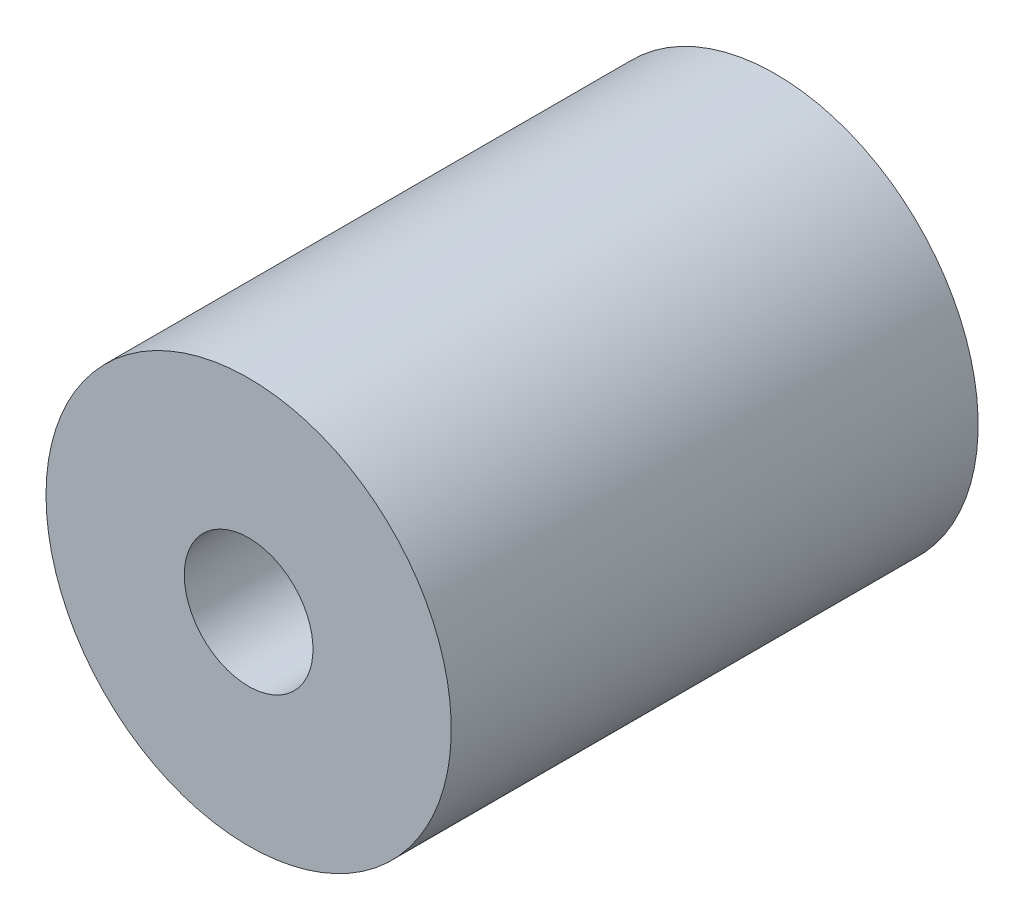
ISO-10303-21;
HEADER;
FILE_DESCRIPTION(('STEP AP214'),'2;1');
FILE_NAME('part.step','',(''),(''),'','','');
FILE_SCHEMA(('AUTOMOTIVE_DESIGN { 1 0 10303 214 1 1 1 1 }'));
ENDSEC;
DATA;
#1=APPLICATION_CONTEXT('core data for automotive mechanical design processes');
#2=APPLICATION_PROTOCOL_DEFINITION('international standard','automotive_design',2000,#1);
#3=PRODUCT_CONTEXT('',#1,'mechanical');
#4=PRODUCT('Part','Part','',(#3));
#5=PRODUCT_RELATED_PRODUCT_CATEGORY('part','',(#4));
#6=PRODUCT_DEFINITION_FORMATION('','',#4);
#7=PRODUCT_DEFINITION_CONTEXT('part definition',#1,'design');
#8=PRODUCT_DEFINITION('design','',#6,#7);
#9=PRODUCT_DEFINITION_SHAPE('','',#8);
#10=(LENGTH_UNIT() NAMED_UNIT(*) SI_UNIT(.MILLI.,.METRE.));
#11=(NAMED_UNIT(*) PLANE_ANGLE_UNIT() SI_UNIT($,.RADIAN.));
#12=(NAMED_UNIT(*) SI_UNIT($,.STERADIAN.) SOLID_ANGLE_UNIT());
#13=UNCERTAINTY_MEASURE_WITH_UNIT(LENGTH_MEASURE(1.E-05),#10,'distance_accuracy_value','');
#14=(GEOMETRIC_REPRESENTATION_CONTEXT(3) GLOBAL_UNCERTAINTY_ASSIGNED_CONTEXT((#13)) GLOBAL_UNIT_ASSIGNED_CONTEXT((#10,
#11,#12)) REPRESENTATION_CONTEXT('',''));
#15=CARTESIAN_POINT('',(0.,0.,0.));
#16=DIRECTION('',(0.,0.,1.));
#17=DIRECTION('',(1.,0.,0.));
#18=AXIS2_PLACEMENT_3D('',#15,#16,#17);
#19=CARTESIAN_POINT('',(0.,0.,26.));
#20=DIRECTION('',(0.,0.,-1.));
#21=DIRECTION('',(-1.,0.,0.));
#22=AXIS2_PLACEMENT_3D('',#19,#20,#21);
#23=CYLINDRICAL_SURFACE('',#22,3.175);
#24=CARTESIAN_POINT('',(0.,0.,26.));
#25=DIRECTION('',(0.,0.,1.));
#26=DIRECTION('',(1.,0.,0.));
#27=AXIS2_PLACEMENT_3D('',#24,#25,#26);
#28=CIRCLE('',#27,3.175);
#29=CARTESIAN_POINT('',(-3.175,0.,26.));
#30=VERTEX_POINT('',#29);
#31=EDGE_CURVE('E44',#30,#30,#28,.T.);
#32=CARTESIAN_POINT('',(0.,0.,6.5));
#33=DIRECTION('',(0.,0.,-1.));
#34=DIRECTION('',(-1.,0.,0.));
#35=AXIS2_PLACEMENT_3D('',#32,#33,#34);
#36=CIRCLE('',#35,3.175);
#37=CARTESIAN_POINT('',(-3.175,0.,6.5));
#38=VERTEX_POINT('',#37);
#39=EDGE_CURVE('E35',#38,#38,#36,.T.);
#40=CARTESIAN_POINT('',(-3.175,0.,26.));
#41=CARTESIAN_POINT('',(-3.175,0.,25.796875));
#42=CARTESIAN_POINT('',(-3.175,0.,25.59375));
#43=CARTESIAN_POINT('',(-3.175,0.,25.1875));
#44=CARTESIAN_POINT('',(-3.175,0.,24.984375));
#45=CARTESIAN_POINT('',(-3.175,0.,24.578125));
#46=CARTESIAN_POINT('',(-3.175,0.,24.375));
#47=CARTESIAN_POINT('',(-3.175,0.,23.96875));
#48=CARTESIAN_POINT('',(-3.175,0.,23.765625));
#49=CARTESIAN_POINT('',(-3.175,0.,23.359375));
#50=CARTESIAN_POINT('',(-3.175,0.,23.15625));
#51=CARTESIAN_POINT('',(-3.175,0.,22.75));
#52=CARTESIAN_POINT('',(-3.175,0.,22.546875));
#53=CARTESIAN_POINT('',(-3.175,0.,22.140625));
#54=CARTESIAN_POINT('',(-3.175,0.,21.9375));
#55=CARTESIAN_POINT('',(-3.175,0.,21.53125));
#56=CARTESIAN_POINT('',(-3.175,0.,21.328125));
#57=CARTESIAN_POINT('',(-3.175,0.,20.921875));
#58=CARTESIAN_POINT('',(-3.175,0.,20.71875));
#59=CARTESIAN_POINT('',(-3.175,0.,20.3125));
#60=CARTESIAN_POINT('',(-3.175,0.,20.109375));
#61=CARTESIAN_POINT('',(-3.175,0.,19.703125));
#62=CARTESIAN_POINT('',(-3.175,0.,19.5));
#63=CARTESIAN_POINT('',(-3.175,0.,19.09375));
#64=CARTESIAN_POINT('',(-3.175,0.,18.890625));
#65=CARTESIAN_POINT('',(-3.175,0.,18.484375));
#66=CARTESIAN_POINT('',(-3.175,0.,18.28125));
#67=CARTESIAN_POINT('',(-3.175,0.,17.875));
#68=CARTESIAN_POINT('',(-3.175,0.,17.671875));
#69=CARTESIAN_POINT('',(-3.175,0.,17.265625));
#70=CARTESIAN_POINT('',(-3.175,0.,17.0625));
#71=CARTESIAN_POINT('',(-3.175,0.,16.65625));
#72=CARTESIAN_POINT('',(-3.175,0.,16.453125));
#73=CARTESIAN_POINT('',(-3.175,0.,16.046875));
#74=CARTESIAN_POINT('',(-3.175,0.,15.84375));
#75=CARTESIAN_POINT('',(-3.175,0.,15.4375));
#76=CARTESIAN_POINT('',(-3.175,0.,15.234375));
#77=CARTESIAN_POINT('',(-3.175,0.,14.828125));
#78=CARTESIAN_POINT('',(-3.175,0.,14.625));
#79=CARTESIAN_POINT('',(-3.175,0.,14.21875));
#80=CARTESIAN_POINT('',(-3.175,0.,14.015625));
#81=CARTESIAN_POINT('',(-3.175,0.,13.609375));
#82=CARTESIAN_POINT('',(-3.175,0.,13.40625));
#83=CARTESIAN_POINT('',(-3.175,0.,13.));
#84=CARTESIAN_POINT('',(-3.175,0.,12.796875));
#85=CARTESIAN_POINT('',(-3.175,0.,12.390625));
#86=CARTESIAN_POINT('',(-3.175,0.,12.1875));
#87=CARTESIAN_POINT('',(-3.175,0.,11.78125));
#88=CARTESIAN_POINT('',(-3.175,0.,11.578125));
#89=CARTESIAN_POINT('',(-3.175,0.,11.171875));
#90=CARTESIAN_POINT('',(-3.175,0.,10.96875));
#91=CARTESIAN_POINT('',(-3.175,0.,10.5625));
#92=CARTESIAN_POINT('',(-3.175,0.,10.359375));
#93=CARTESIAN_POINT('',(-3.175,0.,9.953125));
#94=CARTESIAN_POINT('',(-3.175,0.,9.75));
#95=CARTESIAN_POINT('',(-3.175,0.,9.34375));
#96=CARTESIAN_POINT('',(-3.175,0.,9.140625));
#97=CARTESIAN_POINT('',(-3.175,0.,8.734375));
#98=CARTESIAN_POINT('',(-3.175,0.,8.53125));
#99=CARTESIAN_POINT('',(-3.175,0.,8.125));
#100=CARTESIAN_POINT('',(-3.175,0.,7.921875));
#101=CARTESIAN_POINT('',(-3.175,0.,7.515625));
#102=CARTESIAN_POINT('',(-3.175,0.,7.3125));
#103=CARTESIAN_POINT('',(-3.175,0.,6.90625));
#104=CARTESIAN_POINT('',(-3.175,0.,6.703125));
#105=CARTESIAN_POINT('',(-3.175,0.,6.5));
#106=B_SPLINE_CURVE_WITH_KNOTS('',3,(#40,#41,#42,#43,#44,#45,#46,#47,#48,#49,#50,#51,#52,#53,
#54,#55,#56,#57,#58,#59,#60,#61,#62,#63,#64,#65,#66,#67,#68,#69,#70,#71,#72,#73,#74,#75,#76,#77,
#78,#79,#80,#81,#82,#83,#84,#85,#86,#87,#88,#89,#90,#91,#92,#93,#94,#95,#96,#97,#98,#99,#100,
#101,#102,#103,#104,#105),.UNSPECIFIED.,.F.,.F.,(4,2,2,2,2,2,2,2,2,2,2,2,2,2,2,2,2,2,2,2,2,2,2,
2,2,2,2,2,2,2,2,2,4),(0.,0.609375000000002,1.21875,1.828125,2.4375,3.046875,3.65625,4.265625,
4.875,5.484375,6.09375,6.703125,7.3125,7.921875,8.53125,9.140625,9.75,10.359375,10.96875,
11.578125,12.1875,12.796875,13.40625,14.015625,14.625,15.234375,15.84375,16.453125,17.0625,
17.671875,18.28125,18.890625,19.5),.UNSPECIFIED.);
#107=EDGE_CURVE('BSEAM31',#30,#38,#106,.T.);
#108=ORIENTED_EDGE('',*,*,#31,.T.);
#109=ORIENTED_EDGE('',*,*,#39,.T.);
#110=ORIENTED_EDGE('',*,*,#107,.T.);
#111=ORIENTED_EDGE('',*,*,#107,.F.);
#112=EDGE_LOOP('',(#108,#110,#109,#111));
#113=FACE_BOUND('',#112,.T.);
#114=ADVANCED_FACE('F31',(#113),#23,.F.);
#115=CARTESIAN_POINT('',(0.,0.,26.));
#116=DIRECTION('',(0.,0.,1.));
#117=DIRECTION('',(1.,0.,0.));
#118=AXIS2_PLACEMENT_3D('',#115,#116,#117);
#119=PLANE('',#118);
#120=CARTESIAN_POINT('',(0.,0.,26.));
#121=DIRECTION('',(0.,0.,1.));
#122=DIRECTION('',(1.,0.,0.));
#123=AXIS2_PLACEMENT_3D('',#120,#121,#122);
#124=CIRCLE('',#123,10.);
#125=CARTESIAN_POINT('',(-10.,0.,26.));
#126=VERTEX_POINT('',#125);
#127=EDGE_CURVE('E10',#126,#126,#124,.T.);
#128=ORIENTED_EDGE('',*,*,#127,.T.);
#129=EDGE_LOOP('',(#128));
#130=FACE_BOUND('',#129,.T.);
#131=ORIENTED_EDGE('',*,*,#31,.F.);
#132=EDGE_LOOP('',(#131));
#133=FACE_BOUND('',#132,.T.);
#134=ADVANCED_FACE('F69',(#130,#133),#119,.T.);
#135=CARTESIAN_POINT('',(0.,0.,0.));
#136=DIRECTION('',(0.,0.,1.));
#137=DIRECTION('',(1.,0.,0.));
#138=AXIS2_PLACEMENT_3D('',#135,#136,#137);
#139=PLANE('',#138);
#140=CARTESIAN_POINT('',(0.,0.,0.));
#141=DIRECTION('',(0.,0.,-1.));
#142=DIRECTION('',(-1.,0.,0.));
#143=AXIS2_PLACEMENT_3D('',#140,#141,#142);
#144=CIRCLE('',#143,4.);
#145=CARTESIAN_POINT('',(-4.,0.,0.));
#146=VERTEX_POINT('',#145);
#147=EDGE_CURVE('E48',#146,#146,#144,.T.);
#148=ORIENTED_EDGE('',*,*,#147,.F.);
#149=EDGE_LOOP('',(#148));
#150=FACE_BOUND('',#149,.T.);
#151=CARTESIAN_POINT('',(0.,0.,0.));
#152=DIRECTION('',(0.,0.,1.));
#153=DIRECTION('',(1.,0.,0.));
#154=AXIS2_PLACEMENT_3D('',#151,#152,#153);
#155=CIRCLE('',#154,10.);
#156=CARTESIAN_POINT('',(-10.,0.,0.));
#157=VERTEX_POINT('',#156);
#158=EDGE_CURVE('E39',#157,#157,#155,.T.);
#159=ORIENTED_EDGE('',*,*,#158,.F.);
#160=EDGE_LOOP('',(#159));
#161=FACE_BOUND('',#160,.T.);
#162=ADVANCED_FACE('F75',(#150,#161),#139,.F.);
#163=CARTESIAN_POINT('',(0.,0.,26.));
#164=DIRECTION('',(0.,0.,-1.));
#165=DIRECTION('',(-1.,0.,0.));
#166=AXIS2_PLACEMENT_3D('',#163,#164,#165);
#167=CYLINDRICAL_SURFACE('',#166,10.);
#168=CARTESIAN_POINT('',(-10.,0.,26.));
#169=CARTESIAN_POINT('',(-10.,0.,25.7291666666667));
#170=CARTESIAN_POINT('',(-10.,0.,25.4583333333333));
#171=CARTESIAN_POINT('',(-10.,0.,24.9166666666667));
#172=CARTESIAN_POINT('',(-10.,0.,24.6458333333333));
#173=CARTESIAN_POINT('',(-10.,0.,24.1041666666667));
#174=CARTESIAN_POINT('',(-10.,0.,23.8333333333333));
#175=CARTESIAN_POINT('',(-10.,0.,23.2916666666667));
#176=CARTESIAN_POINT('',(-10.,0.,23.0208333333333));
#177=CARTESIAN_POINT('',(-10.,0.,22.4791666666667));
#178=CARTESIAN_POINT('',(-10.,0.,22.2083333333333));
#179=CARTESIAN_POINT('',(-10.,0.,21.6666666666667));
#180=CARTESIAN_POINT('',(-10.,0.,21.3958333333333));
#181=CARTESIAN_POINT('',(-10.,0.,20.8541666666667));
#182=CARTESIAN_POINT('',(-10.,0.,20.5833333333333));
#183=CARTESIAN_POINT('',(-10.,0.,20.0416666666667));
#184=CARTESIAN_POINT('',(-10.,0.,19.7708333333333));
#185=CARTESIAN_POINT('',(-10.,0.,19.2291666666667));
#186=CARTESIAN_POINT('',(-10.,0.,18.9583333333333));
#187=CARTESIAN_POINT('',(-10.,0.,18.4166666666667));
#188=CARTESIAN_POINT('',(-10.,0.,18.1458333333333));
#189=CARTESIAN_POINT('',(-10.,0.,17.6041666666667));
#190=CARTESIAN_POINT('',(-10.,0.,17.3333333333333));
#191=CARTESIAN_POINT('',(-10.,0.,16.7916666666667));
#192=CARTESIAN_POINT('',(-10.,0.,16.5208333333333));
#193=CARTESIAN_POINT('',(-10.,0.,15.9791666666667));
#194=CARTESIAN_POINT('',(-10.,0.,15.7083333333333));
#195=CARTESIAN_POINT('',(-10.,0.,15.1666666666667));
#196=CARTESIAN_POINT('',(-10.,0.,14.8958333333333));
#197=CARTESIAN_POINT('',(-10.,0.,14.3541666666667));
#198=CARTESIAN_POINT('',(-10.,0.,14.0833333333333));
#199=CARTESIAN_POINT('',(-10.,0.,13.5416666666667));
#200=CARTESIAN_POINT('',(-10.,0.,13.2708333333333));
#201=CARTESIAN_POINT('',(-10.,0.,12.7291666666667));
#202=CARTESIAN_POINT('',(-10.,0.,12.4583333333333));
#203=CARTESIAN_POINT('',(-10.,0.,11.9166666666667));
#204=CARTESIAN_POINT('',(-10.,0.,11.6458333333333));
#205=CARTESIAN_POINT('',(-10.,0.,11.1041666666667));
#206=CARTESIAN_POINT('',(-10.,0.,10.8333333333333));
#207=CARTESIAN_POINT('',(-10.,0.,10.2916666666667));
#208=CARTESIAN_POINT('',(-10.,0.,10.0208333333333));
#209=CARTESIAN_POINT('',(-10.,0.,9.47916666666667));
#210=CARTESIAN_POINT('',(-10.,0.,9.20833333333333));
#211=CARTESIAN_POINT('',(-10.,0.,8.66666666666667));
#212=CARTESIAN_POINT('',(-10.,0.,8.39583333333333));
#213=CARTESIAN_POINT('',(-10.,0.,7.85416666666667));
#214=CARTESIAN_POINT('',(-10.,0.,7.58333333333333));
#215=CARTESIAN_POINT('',(-10.,0.,7.04166666666667));
#216=CARTESIAN_POINT('',(-10.,0.,6.77083333333333));
#217=CARTESIAN_POINT('',(-10.,0.,6.22916666666667));
#218=CARTESIAN_POINT('',(-10.,0.,5.95833333333333));
#219=CARTESIAN_POINT('',(-10.,0.,5.41666666666667));
#220=CARTESIAN_POINT('',(-10.,0.,5.14583333333333));
#221=CARTESIAN_POINT('',(-10.,0.,4.60416666666667));
#222=CARTESIAN_POINT('',(-10.,0.,4.33333333333333));
#223=CARTESIAN_POINT('',(-10.,0.,3.79166666666667));
#224=CARTESIAN_POINT('',(-10.,0.,3.52083333333333));
#225=CARTESIAN_POINT('',(-10.,0.,2.97916666666667));
#226=CARTESIAN_POINT('',(-10.,0.,2.70833333333333));
#227=CARTESIAN_POINT('',(-10.,0.,2.16666666666667));
#228=CARTESIAN_POINT('',(-10.,0.,1.89583333333333));
#229=CARTESIAN_POINT('',(-10.,0.,1.35416666666667));
#230=CARTESIAN_POINT('',(-10.,0.,1.08333333333333));
#231=CARTESIAN_POINT('',(-10.,0.,0.541666666666667));
#232=CARTESIAN_POINT('',(-10.,0.,0.270833333333334));
#233=CARTESIAN_POINT('',(-10.,0.,0.));
#234=B_SPLINE_CURVE_WITH_KNOTS('',3,(#168,#169,#170,#171,#172,#173,#174,#175,#176,#177,#178,
#179,#180,#181,#182,#183,#184,#185,#186,#187,#188,#189,#190,#191,#192,#193,#194,#195,#196,#197,
#198,#199,#200,#201,#202,#203,#204,#205,#206,#207,#208,#209,#210,#211,#212,#213,#214,#215,#216,
#217,#218,#219,#220,#221,#222,#223,#224,#225,#226,#227,#228,#229,#230,#231,#232,#233),
.UNSPECIFIED.,.F.,.F.,(4,2,2,2,2,2,2,2,2,2,2,2,2,2,2,2,2,2,2,2,2,2,2,2,2,2,2,2,2,2,2,2,4),(0.,
0.812499999999997,1.625,2.4375,3.25,4.0625,4.875,5.6875,6.5,7.3125,8.125,8.93749999999999,
9.74999999999999,10.5625,11.375,12.1875,13.,13.8125,14.625,15.4375,16.25,17.0625,17.875,18.6875,
19.5,20.3125,21.125,21.9375,22.75,23.5625,24.375,25.1875,26.),.UNSPECIFIED.);
#235=EDGE_CURVE('BSEAM33',#126,#157,#234,.T.);
#236=ORIENTED_EDGE('',*,*,#127,.F.);
#237=ORIENTED_EDGE('',*,*,#158,.T.);
#238=ORIENTED_EDGE('',*,*,#235,.T.);
#239=ORIENTED_EDGE('',*,*,#235,.F.);
#240=EDGE_LOOP('',(#236,#238,#237,#239));
#241=FACE_BOUND('',#240,.T.);
#242=ADVANCED_FACE('F33',(#241),#167,.T.);
#243=CARTESIAN_POINT('',(0.,0.,6.5));
#244=DIRECTION('',(0.,0.,-1.));
#245=DIRECTION('',(-1.,0.,0.));
#246=AXIS2_PLACEMENT_3D('',#243,#244,#245);
#247=CYLINDRICAL_SURFACE('',#246,4.);
#248=CARTESIAN_POINT('',(0.,0.,6.5));
#249=DIRECTION('',(0.,0.,-1.));
#250=DIRECTION('',(-1.,0.,0.));
#251=AXIS2_PLACEMENT_3D('',#248,#249,#250);
#252=CIRCLE('',#251,4.);
#253=CARTESIAN_POINT('',(-4.,0.,6.5));
#254=VERTEX_POINT('',#253);
#255=EDGE_CURVE('E51',#254,#254,#252,.T.);
#256=CARTESIAN_POINT('',(-4.,0.,6.5));
#257=CARTESIAN_POINT('',(-4.,0.,6.43229166666667));
#258=CARTESIAN_POINT('',(-4.,0.,6.36458333333333));
#259=CARTESIAN_POINT('',(-4.,0.,6.22916666666667));
#260=CARTESIAN_POINT('',(-4.,0.,6.16145833333333));
#261=CARTESIAN_POINT('',(-4.,0.,6.02604166666667));
#262=CARTESIAN_POINT('',(-4.,0.,5.95833333333333));
#263=CARTESIAN_POINT('',(-4.,0.,5.82291666666667));
#264=CARTESIAN_POINT('',(-4.,0.,5.75520833333333));
#265=CARTESIAN_POINT('',(-4.,0.,5.61979166666667));
#266=CARTESIAN_POINT('',(-4.,0.,5.55208333333333));
#267=CARTESIAN_POINT('',(-4.,0.,5.41666666666667));
#268=CARTESIAN_POINT('',(-4.,0.,5.34895833333333));
#269=CARTESIAN_POINT('',(-4.,0.,5.21354166666667));
#270=CARTESIAN_POINT('',(-4.,0.,5.14583333333333));
#271=CARTESIAN_POINT('',(-4.,0.,5.01041666666667));
#272=CARTESIAN_POINT('',(-4.,0.,4.94270833333333));
#273=CARTESIAN_POINT('',(-4.,0.,4.80729166666667));
#274=CARTESIAN_POINT('',(-4.,0.,4.73958333333333));
#275=CARTESIAN_POINT('',(-4.,0.,4.60416666666667));
#276=CARTESIAN_POINT('',(-4.,0.,4.53645833333333));
#277=CARTESIAN_POINT('',(-4.,0.,4.40104166666667));
#278=CARTESIAN_POINT('',(-4.,0.,4.33333333333333));
#279=CARTESIAN_POINT('',(-4.,0.,4.19791666666667));
#280=CARTESIAN_POINT('',(-4.,0.,4.13020833333333));
#281=CARTESIAN_POINT('',(-4.,0.,3.99479166666667));
#282=CARTESIAN_POINT('',(-4.,0.,3.92708333333333));
#283=CARTESIAN_POINT('',(-4.,0.,3.79166666666667));
#284=CARTESIAN_POINT('',(-4.,0.,3.72395833333333));
#285=CARTESIAN_POINT('',(-4.,0.,3.58854166666667));
#286=CARTESIAN_POINT('',(-4.,0.,3.52083333333333));
#287=CARTESIAN_POINT('',(-4.,0.,3.38541666666667));
#288=CARTESIAN_POINT('',(-4.,0.,3.31770833333333));
#289=CARTESIAN_POINT('',(-4.,0.,3.18229166666667));
#290=CARTESIAN_POINT('',(-4.,0.,3.11458333333333));
#291=CARTESIAN_POINT('',(-4.,0.,2.97916666666667));
#292=CARTESIAN_POINT('',(-4.,0.,2.91145833333333));
#293=CARTESIAN_POINT('',(-4.,0.,2.77604166666667));
#294=CARTESIAN_POINT('',(-4.,0.,2.70833333333333));
#295=CARTESIAN_POINT('',(-4.,0.,2.57291666666667));
#296=CARTESIAN_POINT('',(-4.,0.,2.50520833333333));
#297=CARTESIAN_POINT('',(-4.,0.,2.36979166666667));
#298=CARTESIAN_POINT('',(-4.,0.,2.30208333333333));
#299=CARTESIAN_POINT('',(-4.,0.,2.16666666666667));
#300=CARTESIAN_POINT('',(-4.,0.,2.09895833333333));
#301=CARTESIAN_POINT('',(-4.,0.,1.96354166666667));
#302=CARTESIAN_POINT('',(-4.,0.,1.89583333333333));
#303=CARTESIAN_POINT('',(-4.,0.,1.76041666666667));
#304=CARTESIAN_POINT('',(-4.,0.,1.69270833333333));
#305=CARTESIAN_POINT('',(-4.,0.,1.55729166666667));
#306=CARTESIAN_POINT('',(-4.,0.,1.48958333333333));
#307=CARTESIAN_POINT('',(-4.,0.,1.35416666666667));
#308=CARTESIAN_POINT('',(-4.,0.,1.28645833333333));
#309=CARTESIAN_POINT('',(-4.,0.,1.15104166666667));
#310=CARTESIAN_POINT('',(-4.,0.,1.08333333333333));
#311=CARTESIAN_POINT('',(-4.,0.,0.947916666666667));
#312=CARTESIAN_POINT('',(-4.,0.,0.880208333333333));
#313=CARTESIAN_POINT('',(-4.,0.,0.744791666666667));
#314=CARTESIAN_POINT('',(-4.,0.,0.677083333333333));
#315=CARTESIAN_POINT('',(-4.,0.,0.541666666666667));
#316=CARTESIAN_POINT('',(-4.,0.,0.473958333333333));
#317=CARTESIAN_POINT('',(-4.,0.,0.338541666666667));
#318=CARTESIAN_POINT('',(-4.,0.,0.270833333333334));
#319=CARTESIAN_POINT('',(-4.,0.,0.135416666666667));
#320=CARTESIAN_POINT('',(-4.,0.,0.0677083333333334));
#321=CARTESIAN_POINT('',(-4.,0.,0.));
#322=B_SPLINE_CURVE_WITH_KNOTS('',3,(#256,#257,#258,#259,#260,#261,#262,#263,#264,#265,#266,
#267,#268,#269,#270,#271,#272,#273,#274,#275,#276,#277,#278,#279,#280,#281,#282,#283,#284,#285,
#286,#287,#288,#289,#290,#291,#292,#293,#294,#295,#296,#297,#298,#299,#300,#301,#302,#303,#304,
#305,#306,#307,#308,#309,#310,#311,#312,#313,#314,#315,#316,#317,#318,#319,#320,#321),
.UNSPECIFIED.,.F.,.F.,(4,2,2,2,2,2,2,2,2,2,2,2,2,2,2,2,2,2,2,2,2,2,2,2,2,2,2,2,2,2,2,2,4),(0.,
0.203124999999999,0.40625,0.609375,0.8125,1.015625,1.21875,1.421875,1.625,1.828125,2.03125,
2.234375,2.4375,2.640625,2.84375,3.046875,3.25,3.453125,3.65625,3.859375,4.0625,4.265625,
4.46875,4.671875,4.875,5.078125,5.28125,5.484375,5.6875,5.890625,6.09375,6.296875,6.5),.UNSPECIFIED.);
#323=EDGE_CURVE('BSEAM61',#254,#146,#322,.T.);
#324=ORIENTED_EDGE('',*,*,#255,.F.);
#325=ORIENTED_EDGE('',*,*,#147,.T.);
#326=ORIENTED_EDGE('',*,*,#323,.T.);
#327=ORIENTED_EDGE('',*,*,#323,.F.);
#328=EDGE_LOOP('',(#324,#326,#325,#327));
#329=FACE_BOUND('',#328,.T.);
#330=ADVANCED_FACE('F61',(#329),#247,.F.);
#331=CARTESIAN_POINT('',(0.,0.,6.5));
#332=DIRECTION('',(0.,0.,-1.));
#333=DIRECTION('',(-1.,0.,0.));
#334=AXIS2_PLACEMENT_3D('',#331,#332,#333);
#335=PLANE('',#334);
#336=ORIENTED_EDGE('',*,*,#39,.F.);
#337=EDGE_LOOP('',(#336));
#338=FACE_BOUND('',#337,.T.);
#339=ORIENTED_EDGE('',*,*,#255,.T.);
#340=EDGE_LOOP('',(#339));
#341=FACE_BOUND('',#340,.T.);
#342=ADVANCED_FACE('F59',(#338,#341),#335,.T.);
#343=CLOSED_SHELL('',(#114,#134,#162,#242,#330,#342));
#344=MANIFOLD_SOLID_BREP('B2',#343);
#345=ADVANCED_BREP_SHAPE_REPRESENTATION('',(#18,#344),#14);
#346=SHAPE_DEFINITION_REPRESENTATION(#9,#345);
ENDSEC;
END-ISO-10303-21;
